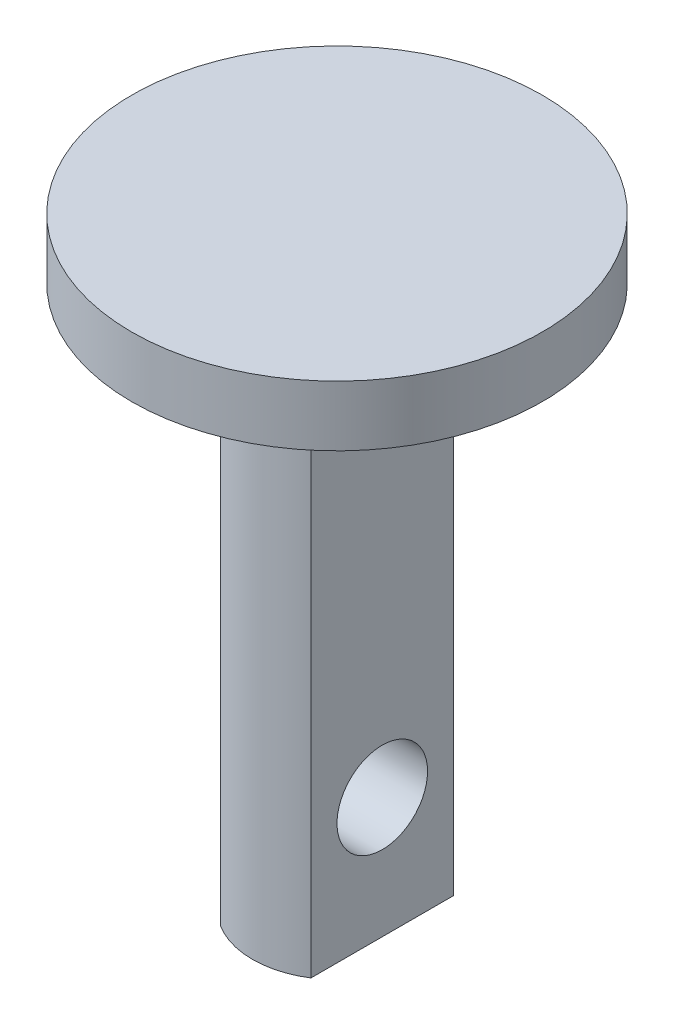
ISO-10303-21;
HEADER;
FILE_DESCRIPTION(('STEP AP214'),'2;1');
FILE_NAME('part.step','',(''),(''),'','','');
FILE_SCHEMA(('AUTOMOTIVE_DESIGN { 1 0 10303 214 1 1 1 1 }'));
ENDSEC;
DATA;
#1=APPLICATION_CONTEXT('core data for automotive mechanical design processes');
#2=APPLICATION_PROTOCOL_DEFINITION('international standard','automotive_design',2000,#1);
#3=PRODUCT_CONTEXT('',#1,'mechanical');
#4=PRODUCT('Part','Part','',(#3));
#5=PRODUCT_RELATED_PRODUCT_CATEGORY('part','',(#4));
#6=PRODUCT_DEFINITION_FORMATION('','',#4);
#7=PRODUCT_DEFINITION_CONTEXT('part definition',#1,'design');
#8=PRODUCT_DEFINITION('design','',#6,#7);
#9=PRODUCT_DEFINITION_SHAPE('','',#8);
#10=(LENGTH_UNIT() NAMED_UNIT(*) SI_UNIT(.MILLI.,.METRE.));
#11=(NAMED_UNIT(*) PLANE_ANGLE_UNIT() SI_UNIT($,.RADIAN.));
#12=(NAMED_UNIT(*) SI_UNIT($,.STERADIAN.) SOLID_ANGLE_UNIT());
#13=UNCERTAINTY_MEASURE_WITH_UNIT(LENGTH_MEASURE(1.E-05),#10,'distance_accuracy_value','');
#14=(GEOMETRIC_REPRESENTATION_CONTEXT(3) GLOBAL_UNCERTAINTY_ASSIGNED_CONTEXT((#13)) GLOBAL_UNIT_ASSIGNED_CONTEXT((#10,
#11,#12)) REPRESENTATION_CONTEXT('',''));
#15=CARTESIAN_POINT('',(0.,0.,0.));
#16=DIRECTION('',(0.,0.,1.));
#17=DIRECTION('',(1.,0.,0.));
#18=AXIS2_PLACEMENT_3D('',#15,#16,#17);
#19=CARTESIAN_POINT('',(0.,-5.,0.));
#20=DIRECTION('',(0.,1.,0.));
#21=DIRECTION('',(0.,0.,1.));
#22=AXIS2_PLACEMENT_3D('',#19,#20,#21);
#23=PLANE('',#22);
#24=CARTESIAN_POINT('',(0.,-5.,0.));
#25=DIRECTION('',(0.,1.,0.));
#26=DIRECTION('',(0.,0.,1.));
#27=AXIS2_PLACEMENT_3D('',#24,#25,#26);
#28=CIRCLE('',#27,17.);
#29=CARTESIAN_POINT('',(0.,-5.,17.));
#30=VERTEX_POINT('',#29);
#31=EDGE_CURVE('E11',#30,#30,#28,.T.);
#32=ORIENTED_EDGE('',*,*,#31,.F.);
#33=EDGE_LOOP('',(#32));
#34=FACE_BOUND('',#33,.T.);
#35=DIRECTION('',(0.,0.,-1.));
#36=VECTOR('',#35,1.);
#37=CARTESIAN_POINT('',(-3.75,-5.,0.));
#38=LINE('',#37,#36);
#39=CARTESIAN_POINT('',(-3.75,-5.,5.91079520876844));
#40=VERTEX_POINT('',#39);
#41=CARTESIAN_POINT('',(-3.75,-5.,-5.91079520876845));
#42=VERTEX_POINT('',#41);
#43=EDGE_CURVE('E52',#40,#42,#38,.T.);
#44=ORIENTED_EDGE('',*,*,#43,.F.);
#45=CARTESIAN_POINT('',(0.,-5.,0.));
#46=DIRECTION('',(0.,1.,0.));
#47=DIRECTION('',(0.,0.,1.));
#48=AXIS2_PLACEMENT_3D('',#45,#46,#47);
#49=CIRCLE('',#48,7.);
#50=CARTESIAN_POINT('',(3.75,-5.,5.91079520876845));
#51=VERTEX_POINT('',#50);
#52=EDGE_CURVE('E111',#40,#51,#49,.T.);
#53=ORIENTED_EDGE('',*,*,#52,.T.);
#54=DIRECTION('',(0.,0.,-1.));
#55=VECTOR('',#54,1.);
#56=CARTESIAN_POINT('',(3.75,-5.,0.));
#57=LINE('',#56,#55);
#58=CARTESIAN_POINT('',(3.75,-5.,-5.91079520876845));
#59=VERTEX_POINT('',#58);
#60=EDGE_CURVE('E109',#51,#59,#57,.T.);
#61=ORIENTED_EDGE('',*,*,#60,.T.);
#62=CARTESIAN_POINT('',(0.,-5.,0.));
#63=DIRECTION('',(0.,1.,0.));
#64=DIRECTION('',(0.,0.,1.));
#65=AXIS2_PLACEMENT_3D('',#62,#63,#64);
#66=CIRCLE('',#65,7.);
#67=EDGE_CURVE('E88',#59,#42,#66,.T.);
#68=ORIENTED_EDGE('',*,*,#67,.T.);
#69=EDGE_LOOP('',(#44,#53,#61,#68));
#70=FACE_BOUND('',#69,.T.);
#71=ADVANCED_FACE('F37',(#34,#70),#23,.F.);
#72=CARTESIAN_POINT('',(0.,-5.,0.));
#73=DIRECTION('',(0.,1.,0.));
#74=DIRECTION('',(0.,0.,1.));
#75=AXIS2_PLACEMENT_3D('',#72,#73,#74);
#76=CYLINDRICAL_SURFACE('',#75,17.);
#77=ORIENTED_EDGE('',*,*,#31,.T.);
#78=EDGE_LOOP('',(#77));
#79=FACE_BOUND('',#78,.T.);
#80=CARTESIAN_POINT('',(0.,0.,0.));
#81=DIRECTION('',(0.,1.,0.));
#82=DIRECTION('',(0.,0.,1.));
#83=AXIS2_PLACEMENT_3D('',#80,#81,#82);
#84=CIRCLE('',#83,17.);
#85=CARTESIAN_POINT('',(0.,0.,17.));
#86=VERTEX_POINT('',#85);
#87=EDGE_CURVE('E41',#86,#86,#84,.T.);
#88=ORIENTED_EDGE('',*,*,#87,.F.);
#89=EDGE_LOOP('',(#88));
#90=FACE_BOUND('',#89,.T.);
#91=ADVANCED_FACE('F39',(#79,#90),#76,.T.);
#92=CARTESIAN_POINT('',(0.,0.,0.));
#93=DIRECTION('',(0.,1.,0.));
#94=DIRECTION('',(0.,0.,1.));
#95=AXIS2_PLACEMENT_3D('',#92,#93,#94);
#96=PLANE('',#95);
#97=ORIENTED_EDGE('',*,*,#87,.T.);
#98=EDGE_LOOP('',(#97));
#99=FACE_BOUND('',#98,.T.);
#100=ADVANCED_FACE('F119',(#99),#96,.T.);
#101=CARTESIAN_POINT('',(-3.75,-50.,0.));
#102=DIRECTION('',(1.,0.,0.));
#103=DIRECTION('',(0.,0.,-1.));
#104=AXIS2_PLACEMENT_3D('',#101,#102,#103);
#105=PLANE('',#104);
#106=CARTESIAN_POINT('',(-3.75,-40.,0.));
#107=DIRECTION('',(1.,0.,0.));
#108=DIRECTION('',(0.,0.,-1.));
#109=AXIS2_PLACEMENT_3D('',#106,#107,#108);
#110=CIRCLE('',#109,3.75);
#111=CARTESIAN_POINT('',(-3.75,-40.,-3.75));
#112=VERTEX_POINT('',#111);
#113=EDGE_CURVE('E107',#112,#112,#110,.T.);
#114=ORIENTED_EDGE('',*,*,#113,.T.);
#115=EDGE_LOOP('',(#114));
#116=FACE_BOUND('',#115,.T.);
#117=ORIENTED_EDGE('',*,*,#43,.T.);
#118=DIRECTION('',(0.,1.,0.));
#119=VECTOR('',#118,1.);
#120=CARTESIAN_POINT('',(-3.75,-50.,-5.91079520876845));
#121=LINE('',#120,#119);
#122=CARTESIAN_POINT('',(-3.75,-50.,-5.91079520876845));
#123=VERTEX_POINT('',#122);
#124=EDGE_CURVE('E93',#123,#42,#121,.T.);
#125=ORIENTED_EDGE('',*,*,#124,.F.);
#126=DIRECTION('',(0.,0.,-1.));
#127=VECTOR('',#126,1.);
#128=CARTESIAN_POINT('',(-3.75,-50.,0.));
#129=LINE('',#128,#127);
#130=CARTESIAN_POINT('',(-3.75,-50.,5.91079520876844));
#131=VERTEX_POINT('',#130);
#132=EDGE_CURVE('E79',#131,#123,#129,.T.);
#133=ORIENTED_EDGE('',*,*,#132,.F.);
#134=DIRECTION('',(0.,1.,0.));
#135=VECTOR('',#134,1.);
#136=CARTESIAN_POINT('',(-3.75,-50.,5.91079520876844));
#137=LINE('',#136,#135);
#138=EDGE_CURVE('E60',#131,#40,#137,.T.);
#139=ORIENTED_EDGE('',*,*,#138,.T.);
#140=EDGE_LOOP('',(#117,#125,#133,#139));
#141=FACE_BOUND('',#140,.T.);
#142=ADVANCED_FACE('F127',(#116,#141),#105,.F.);
#143=CARTESIAN_POINT('',(0.,-50.,0.));
#144=DIRECTION('',(0.,1.,0.));
#145=DIRECTION('',(0.,0.,1.));
#146=AXIS2_PLACEMENT_3D('',#143,#144,#145);
#147=CYLINDRICAL_SURFACE('',#146,7.);
#148=ORIENTED_EDGE('',*,*,#67,.F.);
#149=DIRECTION('',(0.,1.,0.));
#150=VECTOR('',#149,1.);
#151=CARTESIAN_POINT('',(3.75,-50.,-5.91079520876845));
#152=LINE('',#151,#150);
#153=CARTESIAN_POINT('',(3.75,-50.,-5.91079520876845));
#154=VERTEX_POINT('',#153);
#155=EDGE_CURVE('E84',#154,#59,#152,.T.);
#156=ORIENTED_EDGE('',*,*,#155,.F.);
#157=CARTESIAN_POINT('',(0.,-50.,0.));
#158=DIRECTION('',(0.,1.,0.));
#159=DIRECTION('',(0.,0.,1.));
#160=AXIS2_PLACEMENT_3D('',#157,#158,#159);
#161=CIRCLE('',#160,7.);
#162=EDGE_CURVE('E86',#154,#123,#161,.T.);
#163=ORIENTED_EDGE('',*,*,#162,.T.);
#164=ORIENTED_EDGE('',*,*,#124,.T.);
#165=EDGE_LOOP('',(#148,#156,#163,#164));
#166=FACE_BOUND('',#165,.T.);
#167=ADVANCED_FACE('F85',(#166),#147,.T.);
#168=CARTESIAN_POINT('',(3.75,-50.,0.));
#169=DIRECTION('',(1.,0.,0.));
#170=DIRECTION('',(0.,0.,-1.));
#171=AXIS2_PLACEMENT_3D('',#168,#169,#170);
#172=PLANE('',#171);
#173=CARTESIAN_POINT('',(3.75,-40.,0.));
#174=DIRECTION('',(1.,0.,0.));
#175=DIRECTION('',(0.,0.,-1.));
#176=AXIS2_PLACEMENT_3D('',#173,#174,#175);
#177=CIRCLE('',#176,3.75);
#178=CARTESIAN_POINT('',(3.75,-40.,-3.75));
#179=VERTEX_POINT('',#178);
#180=EDGE_CURVE('E154',#179,#179,#177,.T.);
#181=ORIENTED_EDGE('',*,*,#180,.F.);
#182=EDGE_LOOP('',(#181));
#183=FACE_BOUND('',#182,.T.);
#184=ORIENTED_EDGE('',*,*,#60,.F.);
#185=DIRECTION('',(0.,1.,0.));
#186=VECTOR('',#185,1.);
#187=CARTESIAN_POINT('',(3.75,-50.,5.91079520876845));
#188=LINE('',#187,#186);
#189=CARTESIAN_POINT('',(3.75,-50.,5.91079520876845));
#190=VERTEX_POINT('',#189);
#191=EDGE_CURVE('E94',#190,#51,#188,.T.);
#192=ORIENTED_EDGE('',*,*,#191,.F.);
#193=DIRECTION('',(0.,0.,-1.));
#194=VECTOR('',#193,1.);
#195=CARTESIAN_POINT('',(3.75,-50.,0.));
#196=LINE('',#195,#194);
#197=EDGE_CURVE('E98',#190,#154,#196,.T.);
#198=ORIENTED_EDGE('',*,*,#197,.T.);
#199=ORIENTED_EDGE('',*,*,#155,.T.);
#200=EDGE_LOOP('',(#184,#192,#198,#199));
#201=FACE_BOUND('',#200,.T.);
#202=ADVANCED_FACE('F100',(#183,#201),#172,.T.);
#203=CARTESIAN_POINT('',(0.,-50.,0.));
#204=DIRECTION('',(0.,1.,0.));
#205=DIRECTION('',(0.,0.,1.));
#206=AXIS2_PLACEMENT_3D('',#203,#204,#205);
#207=CYLINDRICAL_SURFACE('',#206,7.);
#208=ORIENTED_EDGE('',*,*,#52,.F.);
#209=ORIENTED_EDGE('',*,*,#138,.F.);
#210=CARTESIAN_POINT('',(0.,-50.,0.));
#211=DIRECTION('',(0.,1.,0.));
#212=DIRECTION('',(0.,0.,1.));
#213=AXIS2_PLACEMENT_3D('',#210,#211,#212);
#214=CIRCLE('',#213,7.);
#215=EDGE_CURVE('E101',#131,#190,#214,.T.);
#216=ORIENTED_EDGE('',*,*,#215,.T.);
#217=ORIENTED_EDGE('',*,*,#191,.T.);
#218=EDGE_LOOP('',(#208,#209,#216,#217));
#219=FACE_BOUND('',#218,.T.);
#220=ADVANCED_FACE('F132',(#219),#207,.T.);
#221=CARTESIAN_POINT('',(0.,-50.,0.));
#222=DIRECTION('',(0.,1.,0.));
#223=DIRECTION('',(0.,0.,1.));
#224=AXIS2_PLACEMENT_3D('',#221,#222,#223);
#225=PLANE('',#224);
#226=ORIENTED_EDGE('',*,*,#132,.T.);
#227=ORIENTED_EDGE('',*,*,#162,.F.);
#228=ORIENTED_EDGE('',*,*,#197,.F.);
#229=ORIENTED_EDGE('',*,*,#215,.F.);
#230=EDGE_LOOP('',(#226,#227,#228,#229));
#231=FACE_BOUND('',#230,.T.);
#232=ADVANCED_FACE('F97',(#231),#225,.F.);
#233=CARTESIAN_POINT('',(-17.,-40.,0.));
#234=DIRECTION('',(1.,0.,0.));
#235=DIRECTION('',(0.,0.,-1.));
#236=AXIS2_PLACEMENT_3D('',#233,#234,#235);
#237=CYLINDRICAL_SURFACE('',#236,3.75);
#238=ORIENTED_EDGE('',*,*,#180,.T.);
#239=EDGE_LOOP('',(#238));
#240=FACE_BOUND('',#239,.T.);
#241=ORIENTED_EDGE('',*,*,#113,.F.);
#242=EDGE_LOOP('',(#241));
#243=FACE_BOUND('',#242,.T.);
#244=ADVANCED_FACE('F139',(#240,#243),#237,.F.);
#245=CLOSED_SHELL('',(#71,#91,#100,#142,#167,#202,#220,#232,#244));
#246=MANIFOLD_SOLID_BREP('B2',#245);
#247=ADVANCED_BREP_SHAPE_REPRESENTATION('',(#18,#246),#14);
#248=SHAPE_DEFINITION_REPRESENTATION(#9,#247);
ENDSEC;
END-ISO-10303-21;
